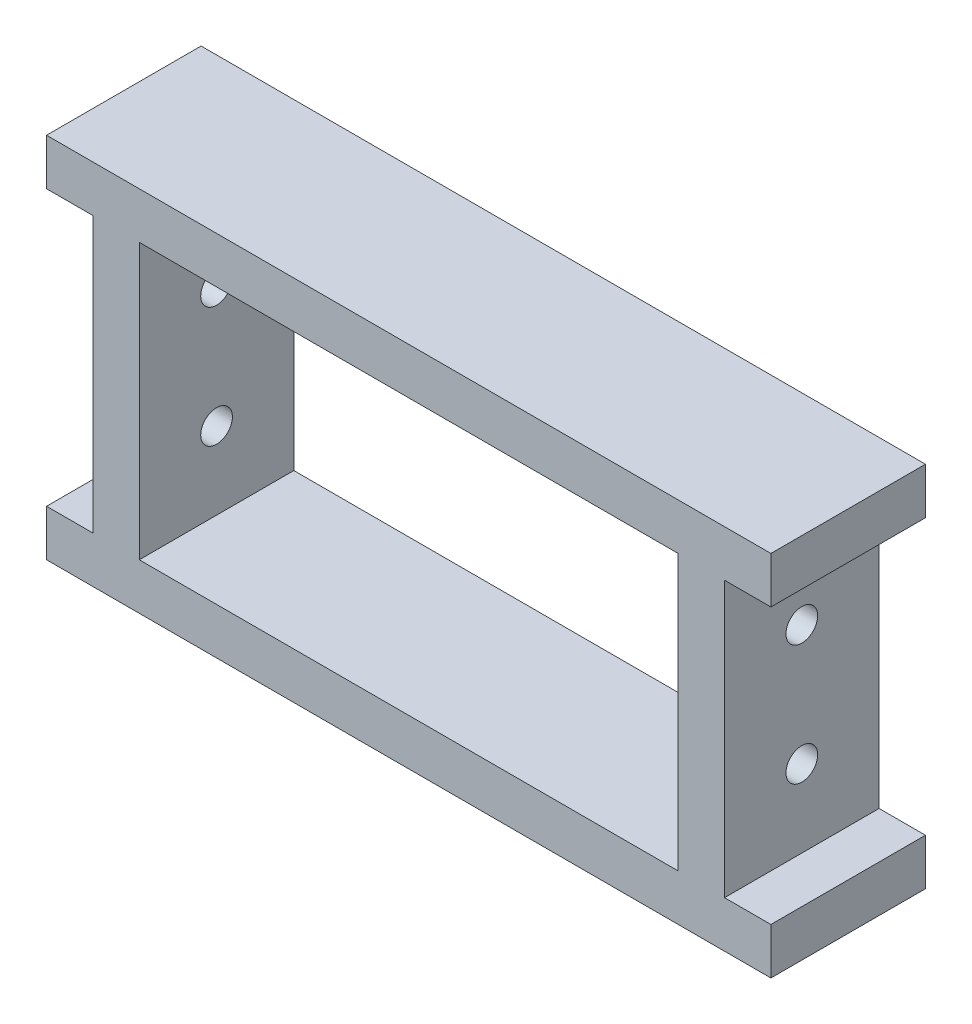
ISO-10303-21;
HEADER;
FILE_DESCRIPTION(('STEP AP214'),'2;1');
FILE_NAME('part.step','',(''),(''),'','','');
FILE_SCHEMA(('AUTOMOTIVE_DESIGN { 1 0 10303 214 1 1 1 1 }'));
ENDSEC;
DATA;
#1=APPLICATION_CONTEXT('core data for automotive mechanical design processes');
#2=APPLICATION_PROTOCOL_DEFINITION('international standard','automotive_design',2000,#1);
#3=PRODUCT_CONTEXT('',#1,'mechanical');
#4=PRODUCT('Part','Part','',(#3));
#5=PRODUCT_RELATED_PRODUCT_CATEGORY('part','',(#4));
#6=PRODUCT_DEFINITION_FORMATION('','',#4);
#7=PRODUCT_DEFINITION_CONTEXT('part definition',#1,'design');
#8=PRODUCT_DEFINITION('design','',#6,#7);
#9=PRODUCT_DEFINITION_SHAPE('','',#8);
#10=(LENGTH_UNIT() NAMED_UNIT(*) SI_UNIT(.MILLI.,.METRE.));
#11=(NAMED_UNIT(*) PLANE_ANGLE_UNIT() SI_UNIT($,.RADIAN.));
#12=(NAMED_UNIT(*) SI_UNIT($,.STERADIAN.) SOLID_ANGLE_UNIT());
#13=UNCERTAINTY_MEASURE_WITH_UNIT(LENGTH_MEASURE(1.E-05),#10,'distance_accuracy_value','');
#14=(GEOMETRIC_REPRESENTATION_CONTEXT(3) GLOBAL_UNCERTAINTY_ASSIGNED_CONTEXT((#13)) GLOBAL_UNIT_ASSIGNED_CONTEXT((#10,
#11,#12)) REPRESENTATION_CONTEXT('',''));
#15=CARTESIAN_POINT('',(0.,0.,0.));
#16=DIRECTION('',(0.,0.,1.));
#17=DIRECTION('',(1.,0.,0.));
#18=AXIS2_PLACEMENT_3D('',#15,#16,#17);
#19=CARTESIAN_POINT('',(-37.7183154819464,9.55195891387468,10.));
#20=DIRECTION('',(0.,0.,1.));
#21=DIRECTION('',(1.,0.,0.));
#22=AXIS2_PLACEMENT_3D('',#19,#20,#21);
#23=PLANE('',#22);
#24=DIRECTION('',(0.,-1.,0.));
#25=VECTOR('',#24,1.);
#26=CARTESIAN_POINT('',(-37.7183154819464,12.5519589138747,10.));
#27=LINE('',#26,#25);
#28=CARTESIAN_POINT('',(-37.7183154819464,12.5519589138747,10.));
#29=VERTEX_POINT('',#28);
#30=CARTESIAN_POINT('',(-37.7183154819464,9.55195891387468,10.));
#31=VERTEX_POINT('',#30);
#32=EDGE_CURVE('E188',#29,#31,#27,.T.);
#33=ORIENTED_EDGE('',*,*,#32,.T.);
#34=DIRECTION('',(1.,0.,0.));
#35=VECTOR('',#34,1.);
#36=CARTESIAN_POINT('',(-37.7183154819464,9.55195891387468,10.));
#37=LINE('',#36,#35);
#38=CARTESIAN_POINT('',(-34.7183154819464,9.55195891387468,10.));
#39=VERTEX_POINT('',#38);
#40=EDGE_CURVE('E191',#31,#39,#37,.T.);
#41=ORIENTED_EDGE('',*,*,#40,.T.);
#42=DIRECTION('',(0.,-1.,0.));
#43=VECTOR('',#42,1.);
#44=CARTESIAN_POINT('',(-34.7183154819464,9.55195891387468,10.));
#45=LINE('',#44,#43);
#46=CARTESIAN_POINT('',(-34.7183154819464,-8.23804108612532,10.));
#47=VERTEX_POINT('',#46);
#48=EDGE_CURVE('E194',#39,#47,#45,.T.);
#49=ORIENTED_EDGE('',*,*,#48,.T.);
#50=DIRECTION('',(-1.,0.,0.));
#51=VECTOR('',#50,1.);
#52=CARTESIAN_POINT('',(-37.7183154819464,-8.23804108612532,10.));
#53=LINE('',#52,#51);
#54=CARTESIAN_POINT('',(-37.7183154819464,-8.23804108612532,10.));
#55=VERTEX_POINT('',#54);
#56=EDGE_CURVE('E196',#47,#55,#53,.T.);
#57=ORIENTED_EDGE('',*,*,#56,.T.);
#58=DIRECTION('',(0.,-1.,0.));
#59=VECTOR('',#58,1.);
#60=CARTESIAN_POINT('',(-37.7183154819464,-8.23804108612532,10.));
#61=LINE('',#60,#59);
#62=CARTESIAN_POINT('',(-37.7183154819464,-11.2380410861253,10.));
#63=VERTEX_POINT('',#62);
#64=EDGE_CURVE('E198',#55,#63,#61,.T.);
#65=ORIENTED_EDGE('',*,*,#64,.T.);
#66=DIRECTION('',(1.,0.,0.));
#67=VECTOR('',#66,1.);
#68=CARTESIAN_POINT('',(-37.7183154819464,-11.2380410861253,10.));
#69=LINE('',#68,#67);
#70=CARTESIAN_POINT('',(9.14963237854921,-11.2380410861253,10.));
#71=VERTEX_POINT('',#70);
#72=EDGE_CURVE('E200',#63,#71,#69,.T.);
#73=ORIENTED_EDGE('',*,*,#72,.T.);
#74=DIRECTION('',(0.,1.,0.));
#75=VECTOR('',#74,1.);
#76=CARTESIAN_POINT('',(9.14963237854921,-8.23804108612532,10.));
#77=LINE('',#76,#75);
#78=CARTESIAN_POINT('',(9.14963237854921,-8.23804108612532,10.));
#79=VERTEX_POINT('',#78);
#80=EDGE_CURVE('E202',#71,#79,#77,.T.);
#81=ORIENTED_EDGE('',*,*,#80,.T.);
#82=DIRECTION('',(-1.,0.,0.));
#83=VECTOR('',#82,1.);
#84=CARTESIAN_POINT('',(9.14963237854921,-8.23804108612532,10.));
#85=LINE('',#84,#83);
#86=CARTESIAN_POINT('',(6.14963237854921,-8.23804108612532,10.));
#87=VERTEX_POINT('',#86);
#88=EDGE_CURVE('E204',#79,#87,#85,.T.);
#89=ORIENTED_EDGE('',*,*,#88,.T.);
#90=DIRECTION('',(0.,1.,0.));
#91=VECTOR('',#90,1.);
#92=CARTESIAN_POINT('',(6.14963237854921,9.55195891387468,10.));
#93=LINE('',#92,#91);
#94=CARTESIAN_POINT('',(6.14963237854921,9.55195891387468,10.));
#95=VERTEX_POINT('',#94);
#96=EDGE_CURVE('E206',#87,#95,#93,.T.);
#97=ORIENTED_EDGE('',*,*,#96,.T.);
#98=DIRECTION('',(1.,0.,0.));
#99=VECTOR('',#98,1.);
#100=CARTESIAN_POINT('',(6.14963237854921,9.55195891387468,10.));
#101=LINE('',#100,#99);
#102=CARTESIAN_POINT('',(9.14963237854921,9.55195891387468,10.));
#103=VERTEX_POINT('',#102);
#104=EDGE_CURVE('E208',#95,#103,#101,.T.);
#105=ORIENTED_EDGE('',*,*,#104,.T.);
#106=DIRECTION('',(0.,1.,0.));
#107=VECTOR('',#106,1.);
#108=CARTESIAN_POINT('',(9.14963237854921,9.55195891387468,10.));
#109=LINE('',#108,#107);
#110=CARTESIAN_POINT('',(9.14963237854921,12.5519589138747,10.));
#111=VERTEX_POINT('',#110);
#112=EDGE_CURVE('E210',#103,#111,#109,.T.);
#113=ORIENTED_EDGE('',*,*,#112,.T.);
#114=DIRECTION('',(-1.,0.,0.));
#115=VECTOR('',#114,1.);
#116=CARTESIAN_POINT('',(-37.7183154819464,12.5519589138747,10.));
#117=LINE('',#116,#115);
#118=EDGE_CURVE('E212',#111,#29,#117,.T.);
#119=ORIENTED_EDGE('',*,*,#118,.T.);
#120=EDGE_LOOP('',(#33,#41,#49,#57,#65,#73,#81,#89,#97,#105,#113,#119));
#121=FACE_BOUND('',#120,.T.);
#122=DIRECTION('',(0.,-1.,0.));
#123=VECTOR('',#122,1.);
#124=CARTESIAN_POINT('',(-31.7183154819464,9.55195891387468,10.));
#125=LINE('',#124,#123);
#126=CARTESIAN_POINT('',(-31.7183154819464,9.55195891387468,10.));
#127=VERTEX_POINT('',#126);
#128=CARTESIAN_POINT('',(-31.7183154819464,-8.23804108612532,10.));
#129=VERTEX_POINT('',#128);
#130=EDGE_CURVE('E158',#127,#129,#125,.T.);
#131=ORIENTED_EDGE('',*,*,#130,.F.);
#132=DIRECTION('',(-1.,0.,0.));
#133=VECTOR('',#132,1.);
#134=CARTESIAN_POINT('',(-31.7183154819464,9.55195891387468,10.));
#135=LINE('',#134,#133);
#136=CARTESIAN_POINT('',(3.14963237854921,9.55195891387468,10.));
#137=VERTEX_POINT('',#136);
#138=EDGE_CURVE('E150',#137,#127,#135,.T.);
#139=ORIENTED_EDGE('',*,*,#138,.F.);
#140=DIRECTION('',(0.,1.,0.));
#141=VECTOR('',#140,1.);
#142=CARTESIAN_POINT('',(3.14963237854921,9.55195891387468,10.));
#143=LINE('',#142,#141);
#144=CARTESIAN_POINT('',(3.14963237854921,-8.23804108612532,10.));
#145=VERTEX_POINT('',#144);
#146=EDGE_CURVE('E172',#145,#137,#143,.T.);
#147=ORIENTED_EDGE('',*,*,#146,.F.);
#148=DIRECTION('',(1.,0.,0.));
#149=VECTOR('',#148,1.);
#150=CARTESIAN_POINT('',(-31.7183154819464,-8.23804108612532,10.));
#151=LINE('',#150,#149);
#152=EDGE_CURVE('E170',#129,#145,#151,.T.);
#153=ORIENTED_EDGE('',*,*,#152,.F.);
#154=EDGE_LOOP('',(#131,#139,#147,#153));
#155=FACE_BOUND('',#154,.T.);
#156=ADVANCED_FACE('F36',(#121,#155),#23,.T.);
#157=CARTESIAN_POINT('',(-37.7183154819464,9.55195891387468,0.));
#158=DIRECTION('',(0.,0.,1.));
#159=DIRECTION('',(1.,0.,0.));
#160=AXIS2_PLACEMENT_3D('',#157,#158,#159);
#161=PLANE('',#160);
#162=DIRECTION('',(0.,-1.,0.));
#163=VECTOR('',#162,1.);
#164=CARTESIAN_POINT('',(-37.7183154819464,12.5519589138747,0.));
#165=LINE('',#164,#163);
#166=CARTESIAN_POINT('',(-37.7183154819464,12.5519589138747,0.));
#167=VERTEX_POINT('',#166);
#168=CARTESIAN_POINT('',(-37.7183154819464,9.55195891387468,0.));
#169=VERTEX_POINT('',#168);
#170=EDGE_CURVE('E166',#167,#169,#165,.T.);
#171=ORIENTED_EDGE('',*,*,#170,.F.);
#172=DIRECTION('',(-1.,0.,0.));
#173=VECTOR('',#172,1.);
#174=CARTESIAN_POINT('',(-37.7183154819464,12.5519589138747,0.));
#175=LINE('',#174,#173);
#176=CARTESIAN_POINT('',(9.14963237854921,12.5519589138747,0.));
#177=VERTEX_POINT('',#176);
#178=EDGE_CURVE('E192',#177,#167,#175,.T.);
#179=ORIENTED_EDGE('',*,*,#178,.F.);
#180=DIRECTION('',(0.,1.,0.));
#181=VECTOR('',#180,1.);
#182=CARTESIAN_POINT('',(9.14963237854921,9.55195891387468,0.));
#183=LINE('',#182,#181);
#184=CARTESIAN_POINT('',(9.14963237854921,9.55195891387468,0.));
#185=VERTEX_POINT('',#184);
#186=EDGE_CURVE('E235',#185,#177,#183,.T.);
#187=ORIENTED_EDGE('',*,*,#186,.F.);
#188=DIRECTION('',(1.,0.,0.));
#189=VECTOR('',#188,1.);
#190=CARTESIAN_POINT('',(6.14963237854921,9.55195891387468,0.));
#191=LINE('',#190,#189);
#192=CARTESIAN_POINT('',(6.14963237854921,9.55195891387468,0.));
#193=VERTEX_POINT('',#192);
#194=EDGE_CURVE('E233',#193,#185,#191,.T.);
#195=ORIENTED_EDGE('',*,*,#194,.F.);
#196=DIRECTION('',(0.,1.,0.));
#197=VECTOR('',#196,1.);
#198=CARTESIAN_POINT('',(6.14963237854921,9.55195891387468,0.));
#199=LINE('',#198,#197);
#200=CARTESIAN_POINT('',(6.14963237854921,-8.23804108612532,0.));
#201=VERTEX_POINT('',#200);
#202=EDGE_CURVE('E231',#201,#193,#199,.T.);
#203=ORIENTED_EDGE('',*,*,#202,.F.);
#204=DIRECTION('',(-1.,0.,0.));
#205=VECTOR('',#204,1.);
#206=CARTESIAN_POINT('',(9.14963237854921,-8.23804108612532,0.));
#207=LINE('',#206,#205);
#208=CARTESIAN_POINT('',(9.14963237854921,-8.23804108612532,0.));
#209=VERTEX_POINT('',#208);
#210=EDGE_CURVE('E229',#209,#201,#207,.T.);
#211=ORIENTED_EDGE('',*,*,#210,.F.);
#212=DIRECTION('',(0.,1.,0.));
#213=VECTOR('',#212,1.);
#214=CARTESIAN_POINT('',(9.14963237854921,-8.23804108612532,0.));
#215=LINE('',#214,#213);
#216=CARTESIAN_POINT('',(9.14963237854921,-11.2380410861253,0.));
#217=VERTEX_POINT('',#216);
#218=EDGE_CURVE('E227',#217,#209,#215,.T.);
#219=ORIENTED_EDGE('',*,*,#218,.F.);
#220=DIRECTION('',(1.,0.,0.));
#221=VECTOR('',#220,1.);
#222=CARTESIAN_POINT('',(-37.7183154819464,-11.2380410861253,0.));
#223=LINE('',#222,#221);
#224=CARTESIAN_POINT('',(-37.7183154819464,-11.2380410861253,0.));
#225=VERTEX_POINT('',#224);
#226=EDGE_CURVE('E225',#225,#217,#223,.T.);
#227=ORIENTED_EDGE('',*,*,#226,.F.);
#228=DIRECTION('',(0.,-1.,0.));
#229=VECTOR('',#228,1.);
#230=CARTESIAN_POINT('',(-37.7183154819464,-8.23804108612532,0.));
#231=LINE('',#230,#229);
#232=CARTESIAN_POINT('',(-37.7183154819464,-8.23804108612532,0.));
#233=VERTEX_POINT('',#232);
#234=EDGE_CURVE('E223',#233,#225,#231,.T.);
#235=ORIENTED_EDGE('',*,*,#234,.F.);
#236=DIRECTION('',(-1.,0.,0.));
#237=VECTOR('',#236,1.);
#238=CARTESIAN_POINT('',(-37.7183154819464,-8.23804108612532,0.));
#239=LINE('',#238,#237);
#240=CARTESIAN_POINT('',(-34.7183154819464,-8.23804108612532,0.));
#241=VERTEX_POINT('',#240);
#242=EDGE_CURVE('E221',#241,#233,#239,.T.);
#243=ORIENTED_EDGE('',*,*,#242,.F.);
#244=DIRECTION('',(0.,-1.,0.));
#245=VECTOR('',#244,1.);
#246=CARTESIAN_POINT('',(-34.7183154819464,9.55195891387468,0.));
#247=LINE('',#246,#245);
#248=CARTESIAN_POINT('',(-34.7183154819464,9.55195891387468,0.));
#249=VERTEX_POINT('',#248);
#250=EDGE_CURVE('E219',#249,#241,#247,.T.);
#251=ORIENTED_EDGE('',*,*,#250,.F.);
#252=DIRECTION('',(1.,0.,0.));
#253=VECTOR('',#252,1.);
#254=CARTESIAN_POINT('',(-37.7183154819464,9.55195891387468,0.));
#255=LINE('',#254,#253);
#256=EDGE_CURVE('E217',#169,#249,#255,.T.);
#257=ORIENTED_EDGE('',*,*,#256,.F.);
#258=EDGE_LOOP('',(#171,#179,#187,#195,#203,#211,#219,#227,#235,#243,#251,#257));
#259=FACE_BOUND('',#258,.T.);
#260=DIRECTION('',(-1.,0.,0.));
#261=VECTOR('',#260,1.);
#262=CARTESIAN_POINT('',(-31.7183154819464,9.55195891387468,0.));
#263=LINE('',#262,#261);
#264=CARTESIAN_POINT('',(3.14963237854921,9.55195891387468,0.));
#265=VERTEX_POINT('',#264);
#266=CARTESIAN_POINT('',(-31.7183154819464,9.55195891387468,0.));
#267=VERTEX_POINT('',#266);
#268=EDGE_CURVE('E60',#265,#267,#263,.T.);
#269=ORIENTED_EDGE('',*,*,#268,.T.);
#270=DIRECTION('',(0.,-1.,0.));
#271=VECTOR('',#270,1.);
#272=CARTESIAN_POINT('',(-31.7183154819464,9.55195891387468,0.));
#273=LINE('',#272,#271);
#274=CARTESIAN_POINT('',(-31.7183154819464,-8.23804108612532,0.));
#275=VERTEX_POINT('',#274);
#276=EDGE_CURVE('E165',#267,#275,#273,.T.);
#277=ORIENTED_EDGE('',*,*,#276,.T.);
#278=DIRECTION('',(1.,0.,0.));
#279=VECTOR('',#278,1.);
#280=CARTESIAN_POINT('',(-31.7183154819464,-8.23804108612532,0.));
#281=LINE('',#280,#279);
#282=CARTESIAN_POINT('',(3.14963237854921,-8.23804108612532,0.));
#283=VERTEX_POINT('',#282);
#284=EDGE_CURVE('E180',#275,#283,#281,.T.);
#285=ORIENTED_EDGE('',*,*,#284,.T.);
#286=DIRECTION('',(0.,1.,0.));
#287=VECTOR('',#286,1.);
#288=CARTESIAN_POINT('',(3.14963237854921,9.55195891387468,0.));
#289=LINE('',#288,#287);
#290=EDGE_CURVE('E159',#283,#265,#289,.T.);
#291=ORIENTED_EDGE('',*,*,#290,.T.);
#292=EDGE_LOOP('',(#269,#277,#285,#291));
#293=FACE_BOUND('',#292,.T.);
#294=ADVANCED_FACE('F278',(#259,#293),#161,.F.);
#295=CARTESIAN_POINT('',(-37.7183154819464,12.5519589138747,10.));
#296=DIRECTION('',(1.,0.,0.));
#297=DIRECTION('',(0.,0.,-1.));
#298=AXIS2_PLACEMENT_3D('',#295,#296,#297);
#299=PLANE('',#298);
#300=ORIENTED_EDGE('',*,*,#170,.T.);
#301=DIRECTION('',(0.,0.,-1.));
#302=VECTOR('',#301,1.);
#303=CARTESIAN_POINT('',(-37.7183154819464,9.55195891387468,10.));
#304=LINE('',#303,#302);
#305=EDGE_CURVE('E11',#31,#169,#304,.T.);
#306=ORIENTED_EDGE('',*,*,#305,.F.);
#307=ORIENTED_EDGE('',*,*,#32,.F.);
#308=DIRECTION('',(0.,0.,-1.));
#309=VECTOR('',#308,1.);
#310=CARTESIAN_POINT('',(-37.7183154819464,12.5519589138747,10.));
#311=LINE('',#310,#309);
#312=EDGE_CURVE('E214',#29,#167,#311,.T.);
#313=ORIENTED_EDGE('',*,*,#312,.T.);
#314=EDGE_LOOP('',(#300,#306,#307,#313));
#315=FACE_BOUND('',#314,.T.);
#316=ADVANCED_FACE('F38',(#315),#299,.F.);
#317=CARTESIAN_POINT('',(-37.7183154819464,9.55195891387468,10.));
#318=DIRECTION('',(0.,1.,0.));
#319=DIRECTION('',(0.,0.,1.));
#320=AXIS2_PLACEMENT_3D('',#317,#318,#319);
#321=PLANE('',#320);
#322=ORIENTED_EDGE('',*,*,#256,.T.);
#323=DIRECTION('',(0.,0.,-1.));
#324=VECTOR('',#323,1.);
#325=CARTESIAN_POINT('',(-34.7183154819464,9.55195891387468,10.));
#326=LINE('',#325,#324);
#327=EDGE_CURVE('E45',#39,#249,#326,.T.);
#328=ORIENTED_EDGE('',*,*,#327,.F.);
#329=ORIENTED_EDGE('',*,*,#40,.F.);
#330=ORIENTED_EDGE('',*,*,#305,.T.);
#331=EDGE_LOOP('',(#322,#328,#329,#330));
#332=FACE_BOUND('',#331,.T.);
#333=ADVANCED_FACE('F295',(#332),#321,.F.);
#334=CARTESIAN_POINT('',(-34.7183154819464,9.55195891387468,10.));
#335=DIRECTION('',(1.,0.,0.));
#336=DIRECTION('',(0.,0.,-1.));
#337=AXIS2_PLACEMENT_3D('',#334,#335,#336);
#338=PLANE('',#337);
#339=CARTESIAN_POINT('',(-34.7183154819464,4.55195891387468,5.));
#340=DIRECTION('',(-1.,0.,0.));
#341=DIRECTION('',(0.,0.,1.));
#342=AXIS2_PLACEMENT_3D('',#339,#340,#341);
#343=CIRCLE('',#342,1.025);
#344=CARTESIAN_POINT('',(-34.7183154819464,4.55195891387468,6.025));
#345=VERTEX_POINT('',#344);
#346=EDGE_CURVE('E529',#345,#345,#343,.T.);
#347=ORIENTED_EDGE('',*,*,#346,.F.);
#348=EDGE_LOOP('',(#347));
#349=FACE_BOUND('',#348,.T.);
#350=CARTESIAN_POINT('',(-34.7183154819464,-3.23804108612532,5.));
#351=DIRECTION('',(-1.,0.,0.));
#352=DIRECTION('',(0.,0.,1.));
#353=AXIS2_PLACEMENT_3D('',#350,#351,#352);
#354=CIRCLE('',#353,1.025);
#355=CARTESIAN_POINT('',(-34.7183154819464,-3.23804108612532,6.025));
#356=VERTEX_POINT('',#355);
#357=EDGE_CURVE('E532',#356,#356,#354,.T.);
#358=ORIENTED_EDGE('',*,*,#357,.F.);
#359=EDGE_LOOP('',(#358));
#360=FACE_BOUND('',#359,.T.);
#361=ORIENTED_EDGE('',*,*,#250,.T.);
#362=DIRECTION('',(0.,0.,-1.));
#363=VECTOR('',#362,1.);
#364=CARTESIAN_POINT('',(-34.7183154819464,-8.23804108612532,10.));
#365=LINE('',#364,#363);
#366=EDGE_CURVE('E264',#47,#241,#365,.T.);
#367=ORIENTED_EDGE('',*,*,#366,.F.);
#368=ORIENTED_EDGE('',*,*,#48,.F.);
#369=ORIENTED_EDGE('',*,*,#327,.T.);
#370=EDGE_LOOP('',(#361,#367,#368,#369));
#371=FACE_BOUND('',#370,.T.);
#372=ADVANCED_FACE('F272',(#349,#360,#371),#338,.F.);
#373=CARTESIAN_POINT('',(-37.7183154819464,-8.23804108612532,10.));
#374=DIRECTION('',(0.,-1.,0.));
#375=DIRECTION('',(0.,0.,-1.));
#376=AXIS2_PLACEMENT_3D('',#373,#374,#375);
#377=PLANE('',#376);
#378=ORIENTED_EDGE('',*,*,#242,.T.);
#379=DIRECTION('',(0.,0.,-1.));
#380=VECTOR('',#379,1.);
#381=CARTESIAN_POINT('',(-37.7183154819464,-8.23804108612532,10.));
#382=LINE('',#381,#380);
#383=EDGE_CURVE('E261',#55,#233,#382,.T.);
#384=ORIENTED_EDGE('',*,*,#383,.F.);
#385=ORIENTED_EDGE('',*,*,#56,.F.);
#386=ORIENTED_EDGE('',*,*,#366,.T.);
#387=EDGE_LOOP('',(#378,#384,#385,#386));
#388=FACE_BOUND('',#387,.T.);
#389=ADVANCED_FACE('F284',(#388),#377,.F.);
#390=CARTESIAN_POINT('',(-37.7183154819464,-8.23804108612532,10.));
#391=DIRECTION('',(1.,0.,0.));
#392=DIRECTION('',(0.,0.,-1.));
#393=AXIS2_PLACEMENT_3D('',#390,#391,#392);
#394=PLANE('',#393);
#395=ORIENTED_EDGE('',*,*,#234,.T.);
#396=DIRECTION('',(0.,0.,-1.));
#397=VECTOR('',#396,1.);
#398=CARTESIAN_POINT('',(-37.7183154819464,-11.2380410861253,10.));
#399=LINE('',#398,#397);
#400=EDGE_CURVE('E258',#63,#225,#399,.T.);
#401=ORIENTED_EDGE('',*,*,#400,.F.);
#402=ORIENTED_EDGE('',*,*,#64,.F.);
#403=ORIENTED_EDGE('',*,*,#383,.T.);
#404=EDGE_LOOP('',(#395,#401,#402,#403));
#405=FACE_BOUND('',#404,.T.);
#406=ADVANCED_FACE('F288',(#405),#394,.F.);
#407=CARTESIAN_POINT('',(-37.7183154819464,-11.2380410861253,10.));
#408=DIRECTION('',(0.,1.,0.));
#409=DIRECTION('',(0.,0.,1.));
#410=AXIS2_PLACEMENT_3D('',#407,#408,#409);
#411=PLANE('',#410);
#412=ORIENTED_EDGE('',*,*,#226,.T.);
#413=DIRECTION('',(0.,0.,-1.));
#414=VECTOR('',#413,1.);
#415=CARTESIAN_POINT('',(9.14963237854921,-11.2380410861253,10.));
#416=LINE('',#415,#414);
#417=EDGE_CURVE('E255',#71,#217,#416,.T.);
#418=ORIENTED_EDGE('',*,*,#417,.F.);
#419=ORIENTED_EDGE('',*,*,#72,.F.);
#420=ORIENTED_EDGE('',*,*,#400,.T.);
#421=EDGE_LOOP('',(#412,#418,#419,#420));
#422=FACE_BOUND('',#421,.T.);
#423=ADVANCED_FACE('F328',(#422),#411,.F.);
#424=CARTESIAN_POINT('',(9.14963237854921,-8.23804108612532,10.));
#425=DIRECTION('',(-1.,0.,0.));
#426=DIRECTION('',(0.,0.,1.));
#427=AXIS2_PLACEMENT_3D('',#424,#425,#426);
#428=PLANE('',#427);
#429=ORIENTED_EDGE('',*,*,#218,.T.);
#430=DIRECTION('',(0.,0.,-1.));
#431=VECTOR('',#430,1.);
#432=CARTESIAN_POINT('',(9.14963237854921,-8.23804108612532,10.));
#433=LINE('',#432,#431);
#434=EDGE_CURVE('E252',#79,#209,#433,.T.);
#435=ORIENTED_EDGE('',*,*,#434,.F.);
#436=ORIENTED_EDGE('',*,*,#80,.F.);
#437=ORIENTED_EDGE('',*,*,#417,.T.);
#438=EDGE_LOOP('',(#429,#435,#436,#437));
#439=FACE_BOUND('',#438,.T.);
#440=ADVANCED_FACE('F326',(#439),#428,.F.);
#441=CARTESIAN_POINT('',(9.14963237854921,-8.23804108612532,10.));
#442=DIRECTION('',(0.,-1.,0.));
#443=DIRECTION('',(0.,0.,-1.));
#444=AXIS2_PLACEMENT_3D('',#441,#442,#443);
#445=PLANE('',#444);
#446=ORIENTED_EDGE('',*,*,#210,.T.);
#447=DIRECTION('',(0.,0.,-1.));
#448=VECTOR('',#447,1.);
#449=CARTESIAN_POINT('',(6.14963237854921,-8.23804108612532,10.));
#450=LINE('',#449,#448);
#451=EDGE_CURVE('E249',#87,#201,#450,.T.);
#452=ORIENTED_EDGE('',*,*,#451,.F.);
#453=ORIENTED_EDGE('',*,*,#88,.F.);
#454=ORIENTED_EDGE('',*,*,#434,.T.);
#455=EDGE_LOOP('',(#446,#452,#453,#454));
#456=FACE_BOUND('',#455,.T.);
#457=ADVANCED_FACE('F322',(#456),#445,.F.);
#458=CARTESIAN_POINT('',(6.14963237854921,9.55195891387468,10.));
#459=DIRECTION('',(-1.,0.,0.));
#460=DIRECTION('',(0.,0.,1.));
#461=AXIS2_PLACEMENT_3D('',#458,#459,#460);
#462=PLANE('',#461);
#463=CARTESIAN_POINT('',(6.14963237854921,4.55195891387468,5.));
#464=DIRECTION('',(1.,0.,0.));
#465=DIRECTION('',(0.,0.,-1.));
#466=AXIS2_PLACEMENT_3D('',#463,#464,#465);
#467=CIRCLE('',#466,1.025);
#468=CARTESIAN_POINT('',(6.14963237854921,4.55195891387468,3.975));
#469=VERTEX_POINT('',#468);
#470=EDGE_CURVE('E547',#469,#469,#467,.T.);
#471=ORIENTED_EDGE('',*,*,#470,.F.);
#472=EDGE_LOOP('',(#471));
#473=FACE_BOUND('',#472,.T.);
#474=CARTESIAN_POINT('',(6.14963237854921,-3.23804108612532,5.));
#475=DIRECTION('',(1.,0.,0.));
#476=DIRECTION('',(0.,0.,-1.));
#477=AXIS2_PLACEMENT_3D('',#474,#475,#476);
#478=CIRCLE('',#477,1.025);
#479=CARTESIAN_POINT('',(6.14963237854921,-3.23804108612532,3.975));
#480=VERTEX_POINT('',#479);
#481=EDGE_CURVE('E544',#480,#480,#478,.T.);
#482=ORIENTED_EDGE('',*,*,#481,.F.);
#483=EDGE_LOOP('',(#482));
#484=FACE_BOUND('',#483,.T.);
#485=ORIENTED_EDGE('',*,*,#202,.T.);
#486=DIRECTION('',(0.,0.,-1.));
#487=VECTOR('',#486,1.);
#488=CARTESIAN_POINT('',(6.14963237854921,9.55195891387468,10.));
#489=LINE('',#488,#487);
#490=EDGE_CURVE('E246',#95,#193,#489,.T.);
#491=ORIENTED_EDGE('',*,*,#490,.F.);
#492=ORIENTED_EDGE('',*,*,#96,.F.);
#493=ORIENTED_EDGE('',*,*,#451,.T.);
#494=EDGE_LOOP('',(#485,#491,#492,#493));
#495=FACE_BOUND('',#494,.T.);
#496=ADVANCED_FACE('F317',(#473,#484,#495),#462,.F.);
#497=CARTESIAN_POINT('',(6.14963237854921,9.55195891387468,10.));
#498=DIRECTION('',(0.,1.,0.));
#499=DIRECTION('',(0.,0.,1.));
#500=AXIS2_PLACEMENT_3D('',#497,#498,#499);
#501=PLANE('',#500);
#502=ORIENTED_EDGE('',*,*,#194,.T.);
#503=DIRECTION('',(0.,0.,-1.));
#504=VECTOR('',#503,1.);
#505=CARTESIAN_POINT('',(9.14963237854921,9.55195891387468,10.));
#506=LINE('',#505,#504);
#507=EDGE_CURVE('E243',#103,#185,#506,.T.);
#508=ORIENTED_EDGE('',*,*,#507,.F.);
#509=ORIENTED_EDGE('',*,*,#104,.F.);
#510=ORIENTED_EDGE('',*,*,#490,.T.);
#511=EDGE_LOOP('',(#502,#508,#509,#510));
#512=FACE_BOUND('',#511,.T.);
#513=ADVANCED_FACE('F311',(#512),#501,.F.);
#514=CARTESIAN_POINT('',(9.14963237854921,9.55195891387468,10.));
#515=DIRECTION('',(-1.,0.,0.));
#516=DIRECTION('',(0.,0.,1.));
#517=AXIS2_PLACEMENT_3D('',#514,#515,#516);
#518=PLANE('',#517);
#519=ORIENTED_EDGE('',*,*,#186,.T.);
#520=DIRECTION('',(0.,0.,-1.));
#521=VECTOR('',#520,1.);
#522=CARTESIAN_POINT('',(9.14963237854921,12.5519589138747,10.));
#523=LINE('',#522,#521);
#524=EDGE_CURVE('E240',#111,#177,#523,.T.);
#525=ORIENTED_EDGE('',*,*,#524,.F.);
#526=ORIENTED_EDGE('',*,*,#112,.F.);
#527=ORIENTED_EDGE('',*,*,#507,.T.);
#528=EDGE_LOOP('',(#519,#525,#526,#527));
#529=FACE_BOUND('',#528,.T.);
#530=ADVANCED_FACE('F307',(#529),#518,.F.);
#531=CARTESIAN_POINT('',(-37.7183154819464,12.5519589138747,10.));
#532=DIRECTION('',(0.,-1.,0.));
#533=DIRECTION('',(0.,0.,-1.));
#534=AXIS2_PLACEMENT_3D('',#531,#532,#533);
#535=PLANE('',#534);
#536=ORIENTED_EDGE('',*,*,#178,.T.);
#537=ORIENTED_EDGE('',*,*,#312,.F.);
#538=ORIENTED_EDGE('',*,*,#118,.F.);
#539=ORIENTED_EDGE('',*,*,#524,.T.);
#540=EDGE_LOOP('',(#536,#537,#538,#539));
#541=FACE_BOUND('',#540,.T.);
#542=ADVANCED_FACE('F302',(#541),#535,.F.);
#543=CARTESIAN_POINT('',(-31.7183154819464,9.55195891387468,10.));
#544=DIRECTION('',(0.,-1.,0.));
#545=DIRECTION('',(0.,0.,-1.));
#546=AXIS2_PLACEMENT_3D('',#543,#544,#545);
#547=PLANE('',#546);
#548=ORIENTED_EDGE('',*,*,#268,.F.);
#549=DIRECTION('',(0.,0.,-1.));
#550=VECTOR('',#549,1.);
#551=CARTESIAN_POINT('',(3.14963237854921,9.55195891387468,10.));
#552=LINE('',#551,#550);
#553=EDGE_CURVE('E154',#137,#265,#552,.T.);
#554=ORIENTED_EDGE('',*,*,#553,.F.);
#555=ORIENTED_EDGE('',*,*,#138,.T.);
#556=DIRECTION('',(0.,0.,-1.));
#557=VECTOR('',#556,1.);
#558=CARTESIAN_POINT('',(-31.7183154819464,9.55195891387468,10.));
#559=LINE('',#558,#557);
#560=EDGE_CURVE('E153',#127,#267,#559,.T.);
#561=ORIENTED_EDGE('',*,*,#560,.T.);
#562=EDGE_LOOP('',(#548,#554,#555,#561));
#563=FACE_BOUND('',#562,.T.);
#564=ADVANCED_FACE('F152',(#563),#547,.T.);
#565=CARTESIAN_POINT('',(-31.7183154819464,9.55195891387468,10.));
#566=DIRECTION('',(1.,0.,0.));
#567=DIRECTION('',(0.,0.,-1.));
#568=AXIS2_PLACEMENT_3D('',#565,#566,#567);
#569=PLANE('',#568);
#570=CARTESIAN_POINT('',(-31.7183154819464,4.55195891387468,5.));
#571=DIRECTION('',(1.,0.,0.));
#572=DIRECTION('',(0.,0.,-1.));
#573=AXIS2_PLACEMENT_3D('',#570,#571,#572);
#574=CIRCLE('',#573,1.025);
#575=CARTESIAN_POINT('',(-31.7183154819464,4.55195891387468,3.975));
#576=VERTEX_POINT('',#575);
#577=EDGE_CURVE('E534',#576,#576,#574,.T.);
#578=ORIENTED_EDGE('',*,*,#577,.F.);
#579=EDGE_LOOP('',(#578));
#580=FACE_BOUND('',#579,.T.);
#581=CARTESIAN_POINT('',(-31.7183154819464,-3.23804108612532,5.));
#582=DIRECTION('',(1.,0.,0.));
#583=DIRECTION('',(0.,0.,-1.));
#584=AXIS2_PLACEMENT_3D('',#581,#582,#583);
#585=CIRCLE('',#584,1.025);
#586=CARTESIAN_POINT('',(-31.7183154819464,-3.23804108612532,3.975));
#587=VERTEX_POINT('',#586);
#588=EDGE_CURVE('E178',#587,#587,#585,.T.);
#589=ORIENTED_EDGE('',*,*,#588,.F.);
#590=EDGE_LOOP('',(#589));
#591=FACE_BOUND('',#590,.T.);
#592=ORIENTED_EDGE('',*,*,#276,.F.);
#593=ORIENTED_EDGE('',*,*,#560,.F.);
#594=ORIENTED_EDGE('',*,*,#130,.T.);
#595=DIRECTION('',(0.,0.,-1.));
#596=VECTOR('',#595,1.);
#597=CARTESIAN_POINT('',(-31.7183154819464,-8.23804108612532,10.));
#598=LINE('',#597,#596);
#599=EDGE_CURVE('E167',#129,#275,#598,.T.);
#600=ORIENTED_EDGE('',*,*,#599,.T.);
#601=EDGE_LOOP('',(#592,#593,#594,#600));
#602=FACE_BOUND('',#601,.T.);
#603=ADVANCED_FACE('F162',(#580,#591,#602),#569,.T.);
#604=CARTESIAN_POINT('',(-31.7183154819464,-8.23804108612532,10.));
#605=DIRECTION('',(0.,1.,0.));
#606=DIRECTION('',(0.,0.,1.));
#607=AXIS2_PLACEMENT_3D('',#604,#605,#606);
#608=PLANE('',#607);
#609=ORIENTED_EDGE('',*,*,#284,.F.);
#610=ORIENTED_EDGE('',*,*,#599,.F.);
#611=ORIENTED_EDGE('',*,*,#152,.T.);
#612=DIRECTION('',(0.,0.,-1.));
#613=VECTOR('',#612,1.);
#614=CARTESIAN_POINT('',(3.14963237854921,-8.23804108612532,10.));
#615=LINE('',#614,#613);
#616=EDGE_CURVE('E52',#145,#283,#615,.T.);
#617=ORIENTED_EDGE('',*,*,#616,.T.);
#618=EDGE_LOOP('',(#609,#610,#611,#617));
#619=FACE_BOUND('',#618,.T.);
#620=ADVANCED_FACE('F390',(#619),#608,.T.);
#621=CARTESIAN_POINT('',(3.14963237854921,9.55195891387468,10.));
#622=DIRECTION('',(-1.,0.,0.));
#623=DIRECTION('',(0.,-1.,0.));
#624=AXIS2_PLACEMENT_3D('',#621,#622,#623);
#625=PLANE('',#624);
#626=CARTESIAN_POINT('',(3.14963237854921,4.55195891387468,5.));
#627=DIRECTION('',(-1.,0.,0.));
#628=DIRECTION('',(0.,-1.,0.));
#629=AXIS2_PLACEMENT_3D('',#626,#627,#628);
#630=CIRCLE('',#629,1.025);
#631=CARTESIAN_POINT('',(3.14963237854921,3.52695891387468,5.));
#632=VERTEX_POINT('',#631);
#633=EDGE_CURVE('E40',#632,#632,#630,.T.);
#634=ORIENTED_EDGE('',*,*,#633,.F.);
#635=EDGE_LOOP('',(#634));
#636=FACE_BOUND('',#635,.T.);
#637=CARTESIAN_POINT('',(3.14963237854921,-3.23804108612532,5.));
#638=DIRECTION('',(-1.,0.,0.));
#639=DIRECTION('',(0.,-1.,0.));
#640=AXIS2_PLACEMENT_3D('',#637,#638,#639);
#641=CIRCLE('',#640,1.025);
#642=CARTESIAN_POINT('',(3.14963237854921,-4.26304108612532,5.));
#643=VERTEX_POINT('',#642);
#644=EDGE_CURVE('E541',#643,#643,#641,.T.);
#645=ORIENTED_EDGE('',*,*,#644,.F.);
#646=EDGE_LOOP('',(#645));
#647=FACE_BOUND('',#646,.T.);
#648=ORIENTED_EDGE('',*,*,#290,.F.);
#649=ORIENTED_EDGE('',*,*,#616,.F.);
#650=ORIENTED_EDGE('',*,*,#146,.T.);
#651=ORIENTED_EDGE('',*,*,#553,.T.);
#652=EDGE_LOOP('',(#648,#649,#650,#651));
#653=FACE_BOUND('',#652,.T.);
#654=ADVANCED_FACE('F398',(#636,#647,#653),#625,.T.);
#655=CARTESIAN_POINT('',(-34.7183154819464,-3.23804108612532,5.));
#656=DIRECTION('',(-1.,0.,0.));
#657=DIRECTION('',(0.,0.,1.));
#658=AXIS2_PLACEMENT_3D('',#655,#656,#657);
#659=CYLINDRICAL_SURFACE('',#658,1.025);
#660=ORIENTED_EDGE('',*,*,#588,.T.);
#661=EDGE_LOOP('',(#660));
#662=FACE_BOUND('',#661,.T.);
#663=ORIENTED_EDGE('',*,*,#357,.T.);
#664=EDGE_LOOP('',(#663));
#665=FACE_BOUND('',#664,.T.);
#666=ADVANCED_FACE('F405',(#662,#665),#659,.F.);
#667=CARTESIAN_POINT('',(-34.7183154819464,4.55195891387468,5.));
#668=DIRECTION('',(-1.,0.,0.));
#669=DIRECTION('',(0.,0.,1.));
#670=AXIS2_PLACEMENT_3D('',#667,#668,#669);
#671=CYLINDRICAL_SURFACE('',#670,1.025);
#672=ORIENTED_EDGE('',*,*,#577,.T.);
#673=EDGE_LOOP('',(#672));
#674=FACE_BOUND('',#673,.T.);
#675=ORIENTED_EDGE('',*,*,#346,.T.);
#676=EDGE_LOOP('',(#675));
#677=FACE_BOUND('',#676,.T.);
#678=ADVANCED_FACE('F414',(#674,#677),#671,.F.);
#679=CARTESIAN_POINT('',(6.14963237854921,-3.23804108612532,5.));
#680=DIRECTION('',(1.,0.,0.));
#681=DIRECTION('',(0.,0.,-1.));
#682=AXIS2_PLACEMENT_3D('',#679,#680,#681);
#683=CYLINDRICAL_SURFACE('',#682,1.025);
#684=ORIENTED_EDGE('',*,*,#644,.T.);
#685=EDGE_LOOP('',(#684));
#686=FACE_BOUND('',#685,.T.);
#687=ORIENTED_EDGE('',*,*,#481,.T.);
#688=EDGE_LOOP('',(#687));
#689=FACE_BOUND('',#688,.T.);
#690=ADVANCED_FACE('F421',(#686,#689),#683,.F.);
#691=CARTESIAN_POINT('',(6.14963237854921,4.55195891387468,5.));
#692=DIRECTION('',(1.,0.,0.));
#693=DIRECTION('',(0.,0.,-1.));
#694=AXIS2_PLACEMENT_3D('',#691,#692,#693);
#695=CYLINDRICAL_SURFACE('',#694,1.025);
#696=ORIENTED_EDGE('',*,*,#633,.T.);
#697=EDGE_LOOP('',(#696));
#698=FACE_BOUND('',#697,.T.);
#699=ORIENTED_EDGE('',*,*,#470,.T.);
#700=EDGE_LOOP('',(#699));
#701=FACE_BOUND('',#700,.T.);
#702=ADVANCED_FACE('F428',(#698,#701),#695,.F.);
#703=CLOSED_SHELL('',(#156,#294,#316,#333,#372,#389,#406,#423,#440,#457,#496,#513,#530,#542,
#564,#603,#620,#654,#666,#678,#690,#702));
#704=MANIFOLD_SOLID_BREP('B2',#703);
#705=ADVANCED_BREP_SHAPE_REPRESENTATION('',(#18,#704),#14);
#706=SHAPE_DEFINITION_REPRESENTATION(#9,#705);
ENDSEC;
END-ISO-10303-21;
